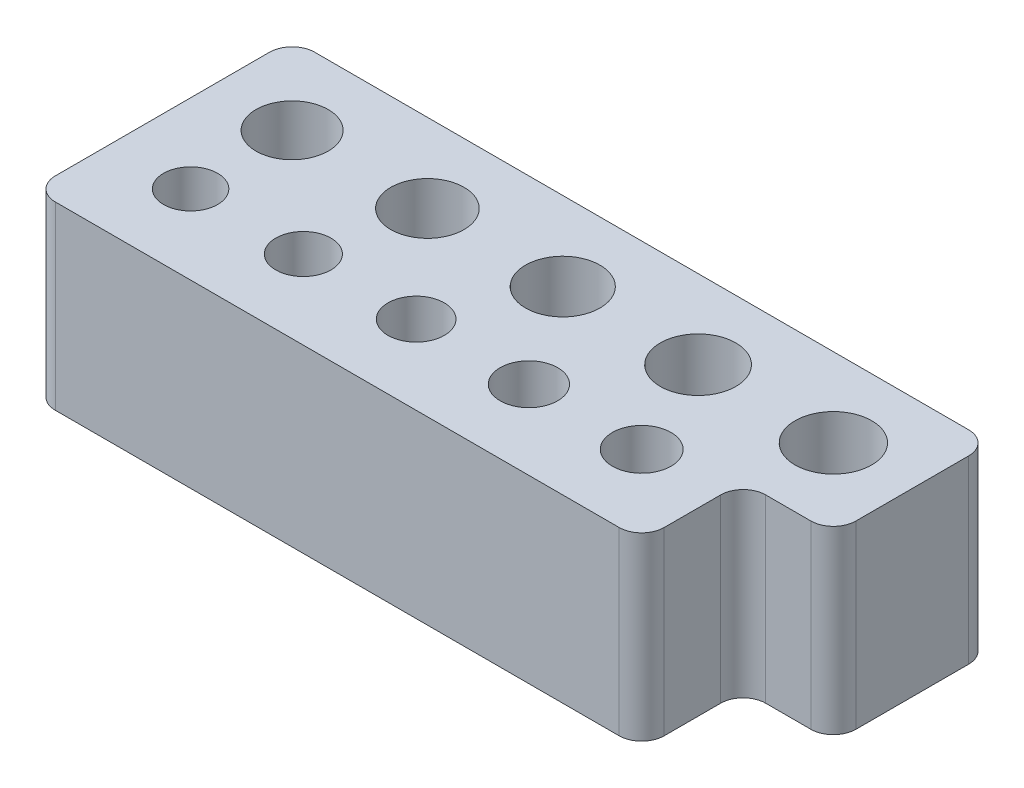
ISO-10303-21;
HEADER;
FILE_DESCRIPTION(('STEP AP214'),'2;1');
FILE_NAME('part.step','',(''),(''),'','','');
FILE_SCHEMA(('AUTOMOTIVE_DESIGN { 1 0 10303 214 1 1 1 1 }'));
ENDSEC;
DATA;
#1=APPLICATION_CONTEXT('core data for automotive mechanical design processes');
#2=APPLICATION_PROTOCOL_DEFINITION('international standard','automotive_design',2000,#1);
#3=PRODUCT_CONTEXT('',#1,'mechanical');
#4=PRODUCT('Part','Part','',(#3));
#5=PRODUCT_RELATED_PRODUCT_CATEGORY('part','',(#4));
#6=PRODUCT_DEFINITION_FORMATION('','',#4);
#7=PRODUCT_DEFINITION_CONTEXT('part definition',#1,'design');
#8=PRODUCT_DEFINITION('design','',#6,#7);
#9=PRODUCT_DEFINITION_SHAPE('','',#8);
#10=(LENGTH_UNIT() NAMED_UNIT(*) SI_UNIT(.MILLI.,.METRE.));
#11=(NAMED_UNIT(*) PLANE_ANGLE_UNIT() SI_UNIT($,.RADIAN.));
#12=(NAMED_UNIT(*) SI_UNIT($,.STERADIAN.) SOLID_ANGLE_UNIT());
#13=UNCERTAINTY_MEASURE_WITH_UNIT(LENGTH_MEASURE(1.E-05),#10,'distance_accuracy_value','');
#14=(GEOMETRIC_REPRESENTATION_CONTEXT(3) GLOBAL_UNCERTAINTY_ASSIGNED_CONTEXT((#13)) GLOBAL_UNIT_ASSIGNED_CONTEXT((#10,
#11,#12)) REPRESENTATION_CONTEXT('',''));
#15=CARTESIAN_POINT('',(0.,0.,0.));
#16=DIRECTION('',(0.,0.,1.));
#17=DIRECTION('',(1.,0.,0.));
#18=AXIS2_PLACEMENT_3D('',#15,#16,#17);
#19=CARTESIAN_POINT('',(0.,8.,0.));
#20=DIRECTION('',(0.,-1.,0.));
#21=DIRECTION('',(0.,0.,-1.));
#22=AXIS2_PLACEMENT_3D('',#19,#20,#21);
#23=PLANE('',#22);
#24=DIRECTION('',(-1.,0.,0.));
#25=VECTOR('',#24,1.);
#26=CARTESIAN_POINT('',(0.,8.,-11.5));
#27=LINE('',#26,#25);
#28=CARTESIAN_POINT('',(30.,8.,-11.5));
#29=VERTEX_POINT('',#28);
#30=CARTESIAN_POINT('',(1.,8.,-11.5));
#31=VERTEX_POINT('',#30);
#32=EDGE_CURVE('E177',#29,#31,#27,.T.);
#33=ORIENTED_EDGE('',*,*,#32,.T.);
#34=CARTESIAN_POINT('',(1.,8.,-10.5));
#35=DIRECTION('',(0.,-1.,0.));
#36=DIRECTION('',(0.,0.,-1.));
#37=AXIS2_PLACEMENT_3D('',#34,#35,#36);
#38=CIRCLE('',#37,1.);
#39=CARTESIAN_POINT('',(0.,8.,-10.5));
#40=VERTEX_POINT('',#39);
#41=EDGE_CURVE('E221',#31,#40,#38,.F.);
#42=ORIENTED_EDGE('',*,*,#41,.T.);
#43=DIRECTION('',(0.,0.,1.));
#44=VECTOR('',#43,1.);
#45=CARTESIAN_POINT('',(0.,8.,0.));
#46=LINE('',#45,#44);
#47=CARTESIAN_POINT('',(0.,8.,-1.));
#48=VERTEX_POINT('',#47);
#49=EDGE_CURVE('E156',#40,#48,#46,.T.);
#50=ORIENTED_EDGE('',*,*,#49,.T.);
#51=CARTESIAN_POINT('',(1.,8.,-1.));
#52=DIRECTION('',(0.,-1.,0.));
#53=DIRECTION('',(0.,0.,-1.));
#54=AXIS2_PLACEMENT_3D('',#51,#52,#53);
#55=CIRCLE('',#54,1.);
#56=CARTESIAN_POINT('',(1.,8.,0.));
#57=VERTEX_POINT('',#56);
#58=EDGE_CURVE('E210',#48,#57,#55,.F.);
#59=ORIENTED_EDGE('',*,*,#58,.T.);
#60=DIRECTION('',(1.,0.,0.));
#61=VECTOR('',#60,1.);
#62=CARTESIAN_POINT('',(0.,8.,0.));
#63=LINE('',#62,#61);
#64=CARTESIAN_POINT('',(26.,8.,0.));
#65=VERTEX_POINT('',#64);
#66=EDGE_CURVE('E276',#57,#65,#63,.T.);
#67=ORIENTED_EDGE('',*,*,#66,.T.);
#68=CARTESIAN_POINT('',(26.,8.,-1.));
#69=DIRECTION('',(0.,-1.,0.));
#70=DIRECTION('',(0.,0.,-1.));
#71=AXIS2_PLACEMENT_3D('',#68,#69,#70);
#72=CIRCLE('',#71,1.);
#73=CARTESIAN_POINT('',(27.,8.,-1.));
#74=VERTEX_POINT('',#73);
#75=EDGE_CURVE('E213',#65,#74,#72,.F.);
#76=ORIENTED_EDGE('',*,*,#75,.T.);
#77=DIRECTION('',(0.,0.,-1.));
#78=VECTOR('',#77,1.);
#79=CARTESIAN_POINT('',(27.,8.,0.));
#80=LINE('',#79,#78);
#81=CARTESIAN_POINT('',(27.,8.,-3.5));
#82=VERTEX_POINT('',#81);
#83=EDGE_CURVE('E267',#74,#82,#80,.T.);
#84=ORIENTED_EDGE('',*,*,#83,.T.);
#85=CARTESIAN_POINT('',(28.,8.,-3.5));
#86=DIRECTION('',(0.,-1.,0.));
#87=DIRECTION('',(0.,0.,-1.));
#88=AXIS2_PLACEMENT_3D('',#85,#86,#87);
#89=CIRCLE('',#88,1.);
#90=CARTESIAN_POINT('',(28.,8.,-4.5));
#91=VERTEX_POINT('',#90);
#92=EDGE_CURVE('E11',#82,#91,#89,.T.);
#93=ORIENTED_EDGE('',*,*,#92,.T.);
#94=DIRECTION('',(1.,0.,0.));
#95=VECTOR('',#94,1.);
#96=CARTESIAN_POINT('',(27.,8.,-4.5));
#97=LINE('',#96,#95);
#98=CARTESIAN_POINT('',(30.,8.,-4.5));
#99=VERTEX_POINT('',#98);
#100=EDGE_CURVE('E266',#91,#99,#97,.T.);
#101=ORIENTED_EDGE('',*,*,#100,.T.);
#102=CARTESIAN_POINT('',(30.,8.,-5.5));
#103=DIRECTION('',(0.,-1.,0.));
#104=DIRECTION('',(0.,0.,-1.));
#105=AXIS2_PLACEMENT_3D('',#102,#103,#104);
#106=CIRCLE('',#105,1.);
#107=CARTESIAN_POINT('',(31.,8.,-5.5));
#108=VERTEX_POINT('',#107);
#109=EDGE_CURVE('E67',#99,#108,#106,.F.);
#110=ORIENTED_EDGE('',*,*,#109,.T.);
#111=DIRECTION('',(0.,0.,-1.));
#112=VECTOR('',#111,1.);
#113=CARTESIAN_POINT('',(31.,8.,-4.5));
#114=LINE('',#113,#112);
#115=CARTESIAN_POINT('',(31.,8.,-10.5));
#116=VERTEX_POINT('',#115);
#117=EDGE_CURVE('E272',#108,#116,#114,.T.);
#118=ORIENTED_EDGE('',*,*,#117,.T.);
#119=CARTESIAN_POINT('',(30.,8.,-10.5));
#120=DIRECTION('',(0.,-1.,0.));
#121=DIRECTION('',(0.,0.,-1.));
#122=AXIS2_PLACEMENT_3D('',#119,#120,#121);
#123=CIRCLE('',#122,1.);
#124=EDGE_CURVE('E218',#116,#29,#123,.F.);
#125=ORIENTED_EDGE('',*,*,#124,.T.);
#126=EDGE_LOOP('',(#33,#42,#50,#59,#67,#76,#84,#93,#101,#110,#118,#125));
#127=FACE_BOUND('',#126,.T.);
#128=CARTESIAN_POINT('',(3.5,8.,-3.5));
#129=DIRECTION('',(0.,1.,0.));
#130=DIRECTION('',(0.,0.,1.));
#131=AXIS2_PLACEMENT_3D('',#128,#129,#130);
#132=CIRCLE('',#131,1.2);
#133=CARTESIAN_POINT('',(3.5,8.,-2.3));
#134=VERTEX_POINT('',#133);
#135=EDGE_CURVE('E166',#134,#134,#132,.T.);
#136=ORIENTED_EDGE('',*,*,#135,.F.);
#137=EDGE_LOOP('',(#136));
#138=FACE_BOUND('',#137,.T.);
#139=CARTESIAN_POINT('',(8.5,8.,-3.5));
#140=DIRECTION('',(0.,1.,0.));
#141=DIRECTION('',(0.,0.,1.));
#142=AXIS2_PLACEMENT_3D('',#139,#140,#141);
#143=CIRCLE('',#142,1.225);
#144=CARTESIAN_POINT('',(8.5,8.,-2.275));
#145=VERTEX_POINT('',#144);
#146=EDGE_CURVE('E286',#145,#145,#143,.T.);
#147=ORIENTED_EDGE('',*,*,#146,.F.);
#148=EDGE_LOOP('',(#147));
#149=FACE_BOUND('',#148,.T.);
#150=CARTESIAN_POINT('',(13.5,8.,-3.5));
#151=DIRECTION('',(0.,1.,0.));
#152=DIRECTION('',(0.,0.,1.));
#153=AXIS2_PLACEMENT_3D('',#150,#151,#152);
#154=CIRCLE('',#153,1.25);
#155=CARTESIAN_POINT('',(13.5,8.,-2.25));
#156=VERTEX_POINT('',#155);
#157=EDGE_CURVE('E292',#156,#156,#154,.T.);
#158=ORIENTED_EDGE('',*,*,#157,.F.);
#159=EDGE_LOOP('',(#158));
#160=FACE_BOUND('',#159,.T.);
#161=CARTESIAN_POINT('',(18.5,8.,-3.5));
#162=DIRECTION('',(0.,1.,0.));
#163=DIRECTION('',(0.,0.,1.));
#164=AXIS2_PLACEMENT_3D('',#161,#162,#163);
#165=CIRCLE('',#164,1.275);
#166=CARTESIAN_POINT('',(18.5,8.,-2.225));
#167=VERTEX_POINT('',#166);
#168=EDGE_CURVE('E300',#167,#167,#165,.T.);
#169=ORIENTED_EDGE('',*,*,#168,.F.);
#170=EDGE_LOOP('',(#169));
#171=FACE_BOUND('',#170,.T.);
#172=CARTESIAN_POINT('',(23.5,8.,-3.5));
#173=DIRECTION('',(0.,1.,0.));
#174=DIRECTION('',(0.,0.,1.));
#175=AXIS2_PLACEMENT_3D('',#172,#173,#174);
#176=CIRCLE('',#175,1.3);
#177=CARTESIAN_POINT('',(23.5,8.,-2.2));
#178=VERTEX_POINT('',#177);
#179=EDGE_CURVE('E308',#178,#178,#176,.T.);
#180=ORIENTED_EDGE('',*,*,#179,.F.);
#181=EDGE_LOOP('',(#180));
#182=FACE_BOUND('',#181,.T.);
#183=CARTESIAN_POINT('',(3.5,8.,-8.));
#184=DIRECTION('',(0.,1.,0.));
#185=DIRECTION('',(0.,0.,1.));
#186=AXIS2_PLACEMENT_3D('',#183,#184,#185);
#187=CIRCLE('',#186,1.6);
#188=CARTESIAN_POINT('',(3.5,8.,-6.4));
#189=VERTEX_POINT('',#188);
#190=EDGE_CURVE('E316',#189,#189,#187,.T.);
#191=ORIENTED_EDGE('',*,*,#190,.F.);
#192=EDGE_LOOP('',(#191));
#193=FACE_BOUND('',#192,.T.);
#194=CARTESIAN_POINT('',(9.5,8.,-8.));
#195=DIRECTION('',(0.,1.,0.));
#196=DIRECTION('',(0.,0.,1.));
#197=AXIS2_PLACEMENT_3D('',#194,#195,#196);
#198=CIRCLE('',#197,1.625);
#199=CARTESIAN_POINT('',(9.5,8.,-6.375));
#200=VERTEX_POINT('',#199);
#201=EDGE_CURVE('E324',#200,#200,#198,.T.);
#202=ORIENTED_EDGE('',*,*,#201,.F.);
#203=EDGE_LOOP('',(#202));
#204=FACE_BOUND('',#203,.T.);
#205=CARTESIAN_POINT('',(15.5,8.,-8.));
#206=DIRECTION('',(0.,1.,0.));
#207=DIRECTION('',(0.,0.,1.));
#208=AXIS2_PLACEMENT_3D('',#205,#206,#207);
#209=CIRCLE('',#208,1.65);
#210=CARTESIAN_POINT('',(15.5,8.,-6.35));
#211=VERTEX_POINT('',#210);
#212=EDGE_CURVE('E332',#211,#211,#209,.T.);
#213=ORIENTED_EDGE('',*,*,#212,.F.);
#214=EDGE_LOOP('',(#213));
#215=FACE_BOUND('',#214,.T.);
#216=CARTESIAN_POINT('',(21.5,8.,-8.));
#217=DIRECTION('',(0.,1.,0.));
#218=DIRECTION('',(0.,0.,1.));
#219=AXIS2_PLACEMENT_3D('',#216,#217,#218);
#220=CIRCLE('',#219,1.675);
#221=CARTESIAN_POINT('',(21.5,8.,-6.325));
#222=VERTEX_POINT('',#221);
#223=EDGE_CURVE('E340',#222,#222,#220,.T.);
#224=ORIENTED_EDGE('',*,*,#223,.F.);
#225=EDGE_LOOP('',(#224));
#226=FACE_BOUND('',#225,.T.);
#227=CARTESIAN_POINT('',(27.5,8.,-8.));
#228=DIRECTION('',(0.,1.,0.));
#229=DIRECTION('',(0.,0.,1.));
#230=AXIS2_PLACEMENT_3D('',#227,#228,#229);
#231=CIRCLE('',#230,1.7);
#232=CARTESIAN_POINT('',(27.5,8.,-6.3));
#233=VERTEX_POINT('',#232);
#234=EDGE_CURVE('E348',#233,#233,#231,.T.);
#235=ORIENTED_EDGE('',*,*,#234,.F.);
#236=EDGE_LOOP('',(#235));
#237=FACE_BOUND('',#236,.T.);
#238=ADVANCED_FACE('F44',(#127,#138,#149,#160,#171,#182,#193,#204,#215,#226,#237),#23,.F.);
#239=CARTESIAN_POINT('',(0.,0.,0.));
#240=DIRECTION('',(0.,-1.,0.));
#241=DIRECTION('',(0.,0.,-1.));
#242=AXIS2_PLACEMENT_3D('',#239,#240,#241);
#243=PLANE('',#242);
#244=CARTESIAN_POINT('',(21.5,0.,-8.));
#245=DIRECTION('',(0.,1.,0.));
#246=DIRECTION('',(0.,0.,1.));
#247=AXIS2_PLACEMENT_3D('',#244,#245,#246);
#248=CIRCLE('',#247,1.675);
#249=CARTESIAN_POINT('',(21.5,0.,-6.325));
#250=VERTEX_POINT('',#249);
#251=EDGE_CURVE('E344',#250,#250,#248,.T.);
#252=ORIENTED_EDGE('',*,*,#251,.T.);
#253=EDGE_LOOP('',(#252));
#254=FACE_BOUND('',#253,.T.);
#255=CARTESIAN_POINT('',(9.5,0.,-8.));
#256=DIRECTION('',(0.,1.,0.));
#257=DIRECTION('',(0.,0.,1.));
#258=AXIS2_PLACEMENT_3D('',#255,#256,#257);
#259=CIRCLE('',#258,1.625);
#260=CARTESIAN_POINT('',(9.5,0.,-6.375));
#261=VERTEX_POINT('',#260);
#262=EDGE_CURVE('E328',#261,#261,#259,.T.);
#263=ORIENTED_EDGE('',*,*,#262,.T.);
#264=EDGE_LOOP('',(#263));
#265=FACE_BOUND('',#264,.T.);
#266=CARTESIAN_POINT('',(23.5,0.,-3.5));
#267=DIRECTION('',(0.,1.,0.));
#268=DIRECTION('',(0.,0.,1.));
#269=AXIS2_PLACEMENT_3D('',#266,#267,#268);
#270=CIRCLE('',#269,1.3);
#271=CARTESIAN_POINT('',(23.5,0.,-2.2));
#272=VERTEX_POINT('',#271);
#273=EDGE_CURVE('E312',#272,#272,#270,.T.);
#274=ORIENTED_EDGE('',*,*,#273,.T.);
#275=EDGE_LOOP('',(#274));
#276=FACE_BOUND('',#275,.T.);
#277=CARTESIAN_POINT('',(13.5,0.,-3.5));
#278=DIRECTION('',(0.,1.,0.));
#279=DIRECTION('',(0.,0.,1.));
#280=AXIS2_PLACEMENT_3D('',#277,#278,#279);
#281=CIRCLE('',#280,1.25);
#282=CARTESIAN_POINT('',(13.5,0.,-2.25));
#283=VERTEX_POINT('',#282);
#284=EDGE_CURVE('E296',#283,#283,#281,.T.);
#285=ORIENTED_EDGE('',*,*,#284,.T.);
#286=EDGE_LOOP('',(#285));
#287=FACE_BOUND('',#286,.T.);
#288=CARTESIAN_POINT('',(3.5,0.,-3.5));
#289=DIRECTION('',(0.,1.,0.));
#290=DIRECTION('',(0.,0.,1.));
#291=AXIS2_PLACEMENT_3D('',#288,#289,#290);
#292=CIRCLE('',#291,1.2);
#293=CARTESIAN_POINT('',(3.5,0.,-2.3));
#294=VERTEX_POINT('',#293);
#295=EDGE_CURVE('E174',#294,#294,#292,.T.);
#296=ORIENTED_EDGE('',*,*,#295,.T.);
#297=EDGE_LOOP('',(#296));
#298=FACE_BOUND('',#297,.T.);
#299=DIRECTION('',(0.,0.,1.));
#300=VECTOR('',#299,1.);
#301=CARTESIAN_POINT('',(0.,0.,0.));
#302=LINE('',#301,#300);
#303=CARTESIAN_POINT('',(0.,0.,-10.5));
#304=VERTEX_POINT('',#303);
#305=CARTESIAN_POINT('',(0.,0.,-1.));
#306=VERTEX_POINT('',#305);
#307=EDGE_CURVE('E153',#304,#306,#302,.T.);
#308=ORIENTED_EDGE('',*,*,#307,.F.);
#309=CARTESIAN_POINT('',(1.,0.,-10.5));
#310=DIRECTION('',(0.,-1.,0.));
#311=DIRECTION('',(0.,0.,-1.));
#312=AXIS2_PLACEMENT_3D('',#309,#310,#311);
#313=CIRCLE('',#312,1.);
#314=CARTESIAN_POINT('',(1.,0.,-11.5));
#315=VERTEX_POINT('',#314);
#316=EDGE_CURVE('E135',#304,#315,#313,.T.);
#317=ORIENTED_EDGE('',*,*,#316,.T.);
#318=DIRECTION('',(-1.,0.,0.));
#319=VECTOR('',#318,1.);
#320=CARTESIAN_POINT('',(0.,0.,-11.5));
#321=LINE('',#320,#319);
#322=CARTESIAN_POINT('',(30.,0.,-11.5));
#323=VERTEX_POINT('',#322);
#324=EDGE_CURVE('E190',#323,#315,#321,.T.);
#325=ORIENTED_EDGE('',*,*,#324,.F.);
#326=CARTESIAN_POINT('',(30.,0.,-10.5));
#327=DIRECTION('',(0.,-1.,0.));
#328=DIRECTION('',(0.,0.,-1.));
#329=AXIS2_PLACEMENT_3D('',#326,#327,#328);
#330=CIRCLE('',#329,1.);
#331=CARTESIAN_POINT('',(31.,0.,-10.5));
#332=VERTEX_POINT('',#331);
#333=EDGE_CURVE('E147',#323,#332,#330,.T.);
#334=ORIENTED_EDGE('',*,*,#333,.T.);
#335=DIRECTION('',(0.,0.,-1.));
#336=VECTOR('',#335,1.);
#337=CARTESIAN_POINT('',(31.,0.,-4.5));
#338=LINE('',#337,#336);
#339=CARTESIAN_POINT('',(31.,0.,-5.5));
#340=VERTEX_POINT('',#339);
#341=EDGE_CURVE('E187',#340,#332,#338,.T.);
#342=ORIENTED_EDGE('',*,*,#341,.F.);
#343=CARTESIAN_POINT('',(30.,0.,-5.5));
#344=DIRECTION('',(0.,-1.,0.));
#345=DIRECTION('',(0.,0.,-1.));
#346=AXIS2_PLACEMENT_3D('',#343,#344,#345);
#347=CIRCLE('',#346,1.);
#348=CARTESIAN_POINT('',(30.,0.,-4.5));
#349=VERTEX_POINT('',#348);
#350=EDGE_CURVE('E200',#340,#349,#347,.T.);
#351=ORIENTED_EDGE('',*,*,#350,.T.);
#352=DIRECTION('',(1.,0.,0.));
#353=VECTOR('',#352,1.);
#354=CARTESIAN_POINT('',(27.,0.,-4.5));
#355=LINE('',#354,#353);
#356=CARTESIAN_POINT('',(28.,0.,-4.5));
#357=VERTEX_POINT('',#356);
#358=EDGE_CURVE('E183',#357,#349,#355,.T.);
#359=ORIENTED_EDGE('',*,*,#358,.F.);
#360=CARTESIAN_POINT('',(28.,0.,-3.5));
#361=DIRECTION('',(0.,-1.,0.));
#362=DIRECTION('',(0.,0.,-1.));
#363=AXIS2_PLACEMENT_3D('',#360,#361,#362);
#364=CIRCLE('',#363,1.);
#365=CARTESIAN_POINT('',(27.,0.,-3.5));
#366=VERTEX_POINT('',#365);
#367=EDGE_CURVE('E53',#357,#366,#364,.F.);
#368=ORIENTED_EDGE('',*,*,#367,.T.);
#369=DIRECTION('',(0.,0.,-1.));
#370=VECTOR('',#369,1.);
#371=CARTESIAN_POINT('',(27.,0.,0.));
#372=LINE('',#371,#370);
#373=CARTESIAN_POINT('',(27.,0.,-1.));
#374=VERTEX_POINT('',#373);
#375=EDGE_CURVE('E171',#374,#366,#372,.T.);
#376=ORIENTED_EDGE('',*,*,#375,.F.);
#377=CARTESIAN_POINT('',(26.,0.,-1.));
#378=DIRECTION('',(0.,-1.,0.));
#379=DIRECTION('',(0.,0.,-1.));
#380=AXIS2_PLACEMENT_3D('',#377,#378,#379);
#381=CIRCLE('',#380,1.);
#382=CARTESIAN_POINT('',(26.,0.,0.));
#383=VERTEX_POINT('',#382);
#384=EDGE_CURVE('E197',#374,#383,#381,.T.);
#385=ORIENTED_EDGE('',*,*,#384,.T.);
#386=DIRECTION('',(1.,0.,0.));
#387=VECTOR('',#386,1.);
#388=CARTESIAN_POINT('',(0.,0.,0.));
#389=LINE('',#388,#387);
#390=CARTESIAN_POINT('',(1.,0.,0.));
#391=VERTEX_POINT('',#390);
#392=EDGE_CURVE('E165',#391,#383,#389,.T.);
#393=ORIENTED_EDGE('',*,*,#392,.F.);
#394=CARTESIAN_POINT('',(1.,0.,-1.));
#395=DIRECTION('',(0.,-1.,0.));
#396=DIRECTION('',(0.,0.,-1.));
#397=AXIS2_PLACEMENT_3D('',#394,#395,#396);
#398=CIRCLE('',#397,1.);
#399=EDGE_CURVE('E158',#391,#306,#398,.T.);
#400=ORIENTED_EDGE('',*,*,#399,.T.);
#401=EDGE_LOOP('',(#308,#317,#325,#334,#342,#351,#359,#368,#376,#385,#393,#400));
#402=FACE_BOUND('',#401,.T.);
#403=CARTESIAN_POINT('',(8.5,0.,-3.5));
#404=DIRECTION('',(0.,1.,0.));
#405=DIRECTION('',(0.,0.,1.));
#406=AXIS2_PLACEMENT_3D('',#403,#404,#405);
#407=CIRCLE('',#406,1.225);
#408=CARTESIAN_POINT('',(8.5,0.,-2.275));
#409=VERTEX_POINT('',#408);
#410=EDGE_CURVE('E288',#409,#409,#407,.T.);
#411=ORIENTED_EDGE('',*,*,#410,.T.);
#412=EDGE_LOOP('',(#411));
#413=FACE_BOUND('',#412,.T.);
#414=CARTESIAN_POINT('',(18.5,0.,-3.5));
#415=DIRECTION('',(0.,1.,0.));
#416=DIRECTION('',(0.,0.,1.));
#417=AXIS2_PLACEMENT_3D('',#414,#415,#416);
#418=CIRCLE('',#417,1.275);
#419=CARTESIAN_POINT('',(18.5,0.,-2.225));
#420=VERTEX_POINT('',#419);
#421=EDGE_CURVE('E304',#420,#420,#418,.T.);
#422=ORIENTED_EDGE('',*,*,#421,.T.);
#423=EDGE_LOOP('',(#422));
#424=FACE_BOUND('',#423,.T.);
#425=CARTESIAN_POINT('',(3.5,0.,-8.));
#426=DIRECTION('',(0.,1.,0.));
#427=DIRECTION('',(0.,0.,1.));
#428=AXIS2_PLACEMENT_3D('',#425,#426,#427);
#429=CIRCLE('',#428,1.6);
#430=CARTESIAN_POINT('',(3.5,0.,-6.4));
#431=VERTEX_POINT('',#430);
#432=EDGE_CURVE('E320',#431,#431,#429,.T.);
#433=ORIENTED_EDGE('',*,*,#432,.T.);
#434=EDGE_LOOP('',(#433));
#435=FACE_BOUND('',#434,.T.);
#436=CARTESIAN_POINT('',(15.5,0.,-8.));
#437=DIRECTION('',(0.,1.,0.));
#438=DIRECTION('',(0.,0.,1.));
#439=AXIS2_PLACEMENT_3D('',#436,#437,#438);
#440=CIRCLE('',#439,1.65);
#441=CARTESIAN_POINT('',(15.5,0.,-6.35));
#442=VERTEX_POINT('',#441);
#443=EDGE_CURVE('E336',#442,#442,#440,.T.);
#444=ORIENTED_EDGE('',*,*,#443,.T.);
#445=EDGE_LOOP('',(#444));
#446=FACE_BOUND('',#445,.T.);
#447=CARTESIAN_POINT('',(27.5,0.,-8.));
#448=DIRECTION('',(0.,1.,0.));
#449=DIRECTION('',(0.,0.,1.));
#450=AXIS2_PLACEMENT_3D('',#447,#448,#449);
#451=CIRCLE('',#450,1.7);
#452=CARTESIAN_POINT('',(27.5,0.,-6.3));
#453=VERTEX_POINT('',#452);
#454=EDGE_CURVE('E352',#453,#453,#451,.T.);
#455=ORIENTED_EDGE('',*,*,#454,.T.);
#456=EDGE_LOOP('',(#455));
#457=FACE_BOUND('',#456,.T.);
#458=ADVANCED_FACE('F161',(#254,#265,#276,#287,#298,#402,#413,#424,#435,#446,#457),#243,.T.);
#459=CARTESIAN_POINT('',(0.,8.,0.));
#460=DIRECTION('',(1.,0.,0.));
#461=DIRECTION('',(0.,0.,-1.));
#462=AXIS2_PLACEMENT_3D('',#459,#460,#461);
#463=PLANE('',#462);
#464=ORIENTED_EDGE('',*,*,#49,.F.);
#465=DIRECTION('',(0.,-1.,0.));
#466=VECTOR('',#465,1.);
#467=CARTESIAN_POINT('',(0.,8.,-10.5));
#468=LINE('',#467,#466);
#469=EDGE_CURVE('E139',#40,#304,#468,.T.);
#470=ORIENTED_EDGE('',*,*,#469,.T.);
#471=ORIENTED_EDGE('',*,*,#307,.T.);
#472=DIRECTION('',(0.,-1.,0.));
#473=VECTOR('',#472,1.);
#474=CARTESIAN_POINT('',(0.,8.,-1.));
#475=LINE('',#474,#473);
#476=EDGE_CURVE('E159',#306,#48,#475,.F.);
#477=ORIENTED_EDGE('',*,*,#476,.T.);
#478=EDGE_LOOP('',(#464,#470,#471,#477));
#479=FACE_BOUND('',#478,.T.);
#480=ADVANCED_FACE('F152',(#479),#463,.F.);
#481=CARTESIAN_POINT('',(0.,8.,0.));
#482=DIRECTION('',(0.,0.,-1.));
#483=DIRECTION('',(-1.,0.,0.));
#484=AXIS2_PLACEMENT_3D('',#481,#482,#483);
#485=PLANE('',#484);
#486=ORIENTED_EDGE('',*,*,#392,.T.);
#487=DIRECTION('',(0.,-1.,0.));
#488=VECTOR('',#487,1.);
#489=CARTESIAN_POINT('',(26.,8.,0.));
#490=LINE('',#489,#488);
#491=EDGE_CURVE('E248',#383,#65,#490,.F.);
#492=ORIENTED_EDGE('',*,*,#491,.T.);
#493=ORIENTED_EDGE('',*,*,#66,.F.);
#494=DIRECTION('',(0.,-1.,0.));
#495=VECTOR('',#494,1.);
#496=CARTESIAN_POINT('',(1.,8.,0.));
#497=LINE('',#496,#495);
#498=EDGE_CURVE('E244',#57,#391,#497,.T.);
#499=ORIENTED_EDGE('',*,*,#498,.T.);
#500=EDGE_LOOP('',(#486,#492,#493,#499));
#501=FACE_BOUND('',#500,.T.);
#502=ADVANCED_FACE('F386',(#501),#485,.F.);
#503=CARTESIAN_POINT('',(27.,8.,0.));
#504=DIRECTION('',(-1.,0.,0.));
#505=DIRECTION('',(0.,0.,1.));
#506=AXIS2_PLACEMENT_3D('',#503,#504,#505);
#507=PLANE('',#506);
#508=ORIENTED_EDGE('',*,*,#375,.T.);
#509=DIRECTION('',(0.,-1.,0.));
#510=VECTOR('',#509,1.);
#511=CARTESIAN_POINT('',(27.,8.,-3.5));
#512=LINE('',#511,#510);
#513=EDGE_CURVE('E241',#366,#82,#512,.F.);
#514=ORIENTED_EDGE('',*,*,#513,.T.);
#515=ORIENTED_EDGE('',*,*,#83,.F.);
#516=DIRECTION('',(0.,-1.,0.));
#517=VECTOR('',#516,1.);
#518=CARTESIAN_POINT('',(27.,8.,-1.));
#519=LINE('',#518,#517);
#520=EDGE_CURVE('E237',#74,#374,#519,.T.);
#521=ORIENTED_EDGE('',*,*,#520,.T.);
#522=EDGE_LOOP('',(#508,#514,#515,#521));
#523=FACE_BOUND('',#522,.T.);
#524=ADVANCED_FACE('F257',(#523),#507,.F.);
#525=CARTESIAN_POINT('',(27.,8.,-4.5));
#526=DIRECTION('',(0.,0.,-1.));
#527=DIRECTION('',(-1.,0.,0.));
#528=AXIS2_PLACEMENT_3D('',#525,#526,#527);
#529=PLANE('',#528);
#530=ORIENTED_EDGE('',*,*,#358,.T.);
#531=DIRECTION('',(0.,-1.,0.));
#532=VECTOR('',#531,1.);
#533=CARTESIAN_POINT('',(30.,8.,-4.5));
#534=LINE('',#533,#532);
#535=EDGE_CURVE('E234',#349,#99,#534,.F.);
#536=ORIENTED_EDGE('',*,*,#535,.T.);
#537=ORIENTED_EDGE('',*,*,#100,.F.);
#538=DIRECTION('',(0.,-1.,0.));
#539=VECTOR('',#538,1.);
#540=CARTESIAN_POINT('',(28.,0.,-4.5));
#541=LINE('',#540,#539);
#542=EDGE_CURVE('E230',#91,#357,#541,.T.);
#543=ORIENTED_EDGE('',*,*,#542,.T.);
#544=EDGE_LOOP('',(#530,#536,#537,#543));
#545=FACE_BOUND('',#544,.T.);
#546=ADVANCED_FACE('F269',(#545),#529,.F.);
#547=CARTESIAN_POINT('',(31.,8.,-4.5));
#548=DIRECTION('',(-1.,0.,0.));
#549=DIRECTION('',(0.,0.,1.));
#550=AXIS2_PLACEMENT_3D('',#547,#548,#549);
#551=PLANE('',#550);
#552=ORIENTED_EDGE('',*,*,#341,.T.);
#553=DIRECTION('',(0.,-1.,0.));
#554=VECTOR('',#553,1.);
#555=CARTESIAN_POINT('',(31.,8.,-10.5));
#556=LINE('',#555,#554);
#557=EDGE_CURVE('E60',#332,#116,#556,.F.);
#558=ORIENTED_EDGE('',*,*,#557,.T.);
#559=ORIENTED_EDGE('',*,*,#117,.F.);
#560=DIRECTION('',(0.,-1.,0.));
#561=VECTOR('',#560,1.);
#562=CARTESIAN_POINT('',(31.,8.,-5.5));
#563=LINE('',#562,#561);
#564=EDGE_CURVE('E224',#108,#340,#563,.T.);
#565=ORIENTED_EDGE('',*,*,#564,.T.);
#566=EDGE_LOOP('',(#552,#558,#559,#565));
#567=FACE_BOUND('',#566,.T.);
#568=ADVANCED_FACE('F378',(#567),#551,.F.);
#569=CARTESIAN_POINT('',(0.,8.,-11.5));
#570=DIRECTION('',(0.,0.,1.));
#571=DIRECTION('',(1.,0.,0.));
#572=AXIS2_PLACEMENT_3D('',#569,#570,#571);
#573=PLANE('',#572);
#574=ORIENTED_EDGE('',*,*,#324,.T.);
#575=DIRECTION('',(0.,-1.,0.));
#576=VECTOR('',#575,1.);
#577=CARTESIAN_POINT('',(1.,8.,-11.5));
#578=LINE('',#577,#576);
#579=EDGE_CURVE('E140',#315,#31,#578,.F.);
#580=ORIENTED_EDGE('',*,*,#579,.T.);
#581=ORIENTED_EDGE('',*,*,#32,.F.);
#582=DIRECTION('',(0.,-1.,0.));
#583=VECTOR('',#582,1.);
#584=CARTESIAN_POINT('',(30.,8.,-11.5));
#585=LINE('',#584,#583);
#586=EDGE_CURVE('E146',#29,#323,#585,.T.);
#587=ORIENTED_EDGE('',*,*,#586,.T.);
#588=EDGE_LOOP('',(#574,#580,#581,#587));
#589=FACE_BOUND('',#588,.T.);
#590=ADVANCED_FACE('F375',(#589),#573,.F.);
#591=CARTESIAN_POINT('',(3.5,8.,-3.5));
#592=DIRECTION('',(0.,-1.,0.));
#593=DIRECTION('',(0.,0.,-1.));
#594=AXIS2_PLACEMENT_3D('',#591,#592,#593);
#595=CYLINDRICAL_SURFACE('',#594,1.2);
#596=ORIENTED_EDGE('',*,*,#135,.T.);
#597=EDGE_LOOP('',(#596));
#598=FACE_BOUND('',#597,.T.);
#599=ORIENTED_EDGE('',*,*,#295,.F.);
#600=EDGE_LOOP('',(#599));
#601=FACE_BOUND('',#600,.T.);
#602=ADVANCED_FACE('F372',(#598,#601),#595,.F.);
#603=CARTESIAN_POINT('',(8.5,8.,-3.5));
#604=DIRECTION('',(0.,-1.,0.));
#605=DIRECTION('',(0.,0.,-1.));
#606=AXIS2_PLACEMENT_3D('',#603,#604,#605);
#607=CYLINDRICAL_SURFACE('',#606,1.225);
#608=ORIENTED_EDGE('',*,*,#146,.T.);
#609=EDGE_LOOP('',(#608));
#610=FACE_BOUND('',#609,.T.);
#611=ORIENTED_EDGE('',*,*,#410,.F.);
#612=EDGE_LOOP('',(#611));
#613=FACE_BOUND('',#612,.T.);
#614=ADVANCED_FACE('F529',(#610,#613),#607,.F.);
#615=CARTESIAN_POINT('',(13.5,8.,-3.5));
#616=DIRECTION('',(0.,-1.,0.));
#617=DIRECTION('',(0.,0.,-1.));
#618=AXIS2_PLACEMENT_3D('',#615,#616,#617);
#619=CYLINDRICAL_SURFACE('',#618,1.25);
#620=ORIENTED_EDGE('',*,*,#157,.T.);
#621=EDGE_LOOP('',(#620));
#622=FACE_BOUND('',#621,.T.);
#623=ORIENTED_EDGE('',*,*,#284,.F.);
#624=EDGE_LOOP('',(#623));
#625=FACE_BOUND('',#624,.T.);
#626=ADVANCED_FACE('F519',(#622,#625),#619,.F.);
#627=CARTESIAN_POINT('',(18.5,8.,-3.5));
#628=DIRECTION('',(0.,-1.,0.));
#629=DIRECTION('',(0.,0.,-1.));
#630=AXIS2_PLACEMENT_3D('',#627,#628,#629);
#631=CYLINDRICAL_SURFACE('',#630,1.275);
#632=ORIENTED_EDGE('',*,*,#168,.T.);
#633=EDGE_LOOP('',(#632));
#634=FACE_BOUND('',#633,.T.);
#635=ORIENTED_EDGE('',*,*,#421,.F.);
#636=EDGE_LOOP('',(#635));
#637=FACE_BOUND('',#636,.T.);
#638=ADVANCED_FACE('F509',(#634,#637),#631,.F.);
#639=CARTESIAN_POINT('',(23.5,8.,-3.5));
#640=DIRECTION('',(0.,-1.,0.));
#641=DIRECTION('',(0.,0.,-1.));
#642=AXIS2_PLACEMENT_3D('',#639,#640,#641);
#643=CYLINDRICAL_SURFACE('',#642,1.3);
#644=ORIENTED_EDGE('',*,*,#179,.T.);
#645=EDGE_LOOP('',(#644));
#646=FACE_BOUND('',#645,.T.);
#647=ORIENTED_EDGE('',*,*,#273,.F.);
#648=EDGE_LOOP('',(#647));
#649=FACE_BOUND('',#648,.T.);
#650=ADVANCED_FACE('F499',(#646,#649),#643,.F.);
#651=CARTESIAN_POINT('',(3.5,8.,-8.));
#652=DIRECTION('',(0.,-1.,0.));
#653=DIRECTION('',(0.,0.,-1.));
#654=AXIS2_PLACEMENT_3D('',#651,#652,#653);
#655=CYLINDRICAL_SURFACE('',#654,1.6);
#656=ORIENTED_EDGE('',*,*,#190,.T.);
#657=EDGE_LOOP('',(#656));
#658=FACE_BOUND('',#657,.T.);
#659=ORIENTED_EDGE('',*,*,#432,.F.);
#660=EDGE_LOOP('',(#659));
#661=FACE_BOUND('',#660,.T.);
#662=ADVANCED_FACE('F489',(#658,#661),#655,.F.);
#663=CARTESIAN_POINT('',(9.5,8.,-8.));
#664=DIRECTION('',(0.,-1.,0.));
#665=DIRECTION('',(0.,0.,-1.));
#666=AXIS2_PLACEMENT_3D('',#663,#664,#665);
#667=CYLINDRICAL_SURFACE('',#666,1.625);
#668=ORIENTED_EDGE('',*,*,#201,.T.);
#669=EDGE_LOOP('',(#668));
#670=FACE_BOUND('',#669,.T.);
#671=ORIENTED_EDGE('',*,*,#262,.F.);
#672=EDGE_LOOP('',(#671));
#673=FACE_BOUND('',#672,.T.);
#674=ADVANCED_FACE('F479',(#670,#673),#667,.F.);
#675=CARTESIAN_POINT('',(15.5,8.,-8.));
#676=DIRECTION('',(0.,-1.,0.));
#677=DIRECTION('',(0.,0.,-1.));
#678=AXIS2_PLACEMENT_3D('',#675,#676,#677);
#679=CYLINDRICAL_SURFACE('',#678,1.65);
#680=ORIENTED_EDGE('',*,*,#212,.T.);
#681=EDGE_LOOP('',(#680));
#682=FACE_BOUND('',#681,.T.);
#683=ORIENTED_EDGE('',*,*,#443,.F.);
#684=EDGE_LOOP('',(#683));
#685=FACE_BOUND('',#684,.T.);
#686=ADVANCED_FACE('F469',(#682,#685),#679,.F.);
#687=CARTESIAN_POINT('',(21.5,8.,-8.));
#688=DIRECTION('',(0.,-1.,0.));
#689=DIRECTION('',(0.,0.,-1.));
#690=AXIS2_PLACEMENT_3D('',#687,#688,#689);
#691=CYLINDRICAL_SURFACE('',#690,1.675);
#692=ORIENTED_EDGE('',*,*,#223,.T.);
#693=EDGE_LOOP('',(#692));
#694=FACE_BOUND('',#693,.T.);
#695=ORIENTED_EDGE('',*,*,#251,.F.);
#696=EDGE_LOOP('',(#695));
#697=FACE_BOUND('',#696,.T.);
#698=ADVANCED_FACE('F460',(#694,#697),#691,.F.);
#699=CARTESIAN_POINT('',(27.5,8.,-8.));
#700=DIRECTION('',(0.,-1.,0.));
#701=DIRECTION('',(0.,0.,-1.));
#702=AXIS2_PLACEMENT_3D('',#699,#700,#701);
#703=CYLINDRICAL_SURFACE('',#702,1.7);
#704=ORIENTED_EDGE('',*,*,#234,.T.);
#705=EDGE_LOOP('',(#704));
#706=FACE_BOUND('',#705,.T.);
#707=ORIENTED_EDGE('',*,*,#454,.F.);
#708=EDGE_LOOP('',(#707));
#709=FACE_BOUND('',#708,.T.);
#710=ADVANCED_FACE('F360',(#706,#709),#703,.F.);
#711=CARTESIAN_POINT('',(1.,8.,-10.5));
#712=DIRECTION('',(0.,-1.,0.));
#713=DIRECTION('',(0.,0.,-1.));
#714=AXIS2_PLACEMENT_3D('',#711,#712,#713);
#715=CYLINDRICAL_SURFACE('',#714,1.);
#716=ORIENTED_EDGE('',*,*,#41,.F.);
#717=ORIENTED_EDGE('',*,*,#579,.F.);
#718=ORIENTED_EDGE('',*,*,#316,.F.);
#719=ORIENTED_EDGE('',*,*,#469,.F.);
#720=EDGE_LOOP('',(#716,#717,#718,#719));
#721=FACE_BOUND('',#720,.T.);
#722=ADVANCED_FACE('F138',(#721),#715,.T.);
#723=CARTESIAN_POINT('',(30.,8.,-10.5));
#724=DIRECTION('',(0.,-1.,0.));
#725=DIRECTION('',(0.,0.,-1.));
#726=AXIS2_PLACEMENT_3D('',#723,#724,#725);
#727=CYLINDRICAL_SURFACE('',#726,1.);
#728=ORIENTED_EDGE('',*,*,#124,.F.);
#729=ORIENTED_EDGE('',*,*,#557,.F.);
#730=ORIENTED_EDGE('',*,*,#333,.F.);
#731=ORIENTED_EDGE('',*,*,#586,.F.);
#732=EDGE_LOOP('',(#728,#729,#730,#731));
#733=FACE_BOUND('',#732,.T.);
#734=ADVANCED_FACE('F394',(#733),#727,.T.);
#735=CARTESIAN_POINT('',(30.,8.,-5.5));
#736=DIRECTION('',(0.,-1.,0.));
#737=DIRECTION('',(0.,0.,-1.));
#738=AXIS2_PLACEMENT_3D('',#735,#736,#737);
#739=CYLINDRICAL_SURFACE('',#738,1.);
#740=ORIENTED_EDGE('',*,*,#109,.F.);
#741=ORIENTED_EDGE('',*,*,#535,.F.);
#742=ORIENTED_EDGE('',*,*,#350,.F.);
#743=ORIENTED_EDGE('',*,*,#564,.F.);
#744=EDGE_LOOP('',(#740,#741,#742,#743));
#745=FACE_BOUND('',#744,.T.);
#746=ADVANCED_FACE('F397',(#745),#739,.T.);
#747=CARTESIAN_POINT('',(28.,8.,-3.5));
#748=DIRECTION('',(0.,1.,0.));
#749=DIRECTION('',(0.,0.,1.));
#750=AXIS2_PLACEMENT_3D('',#747,#748,#749);
#751=CYLINDRICAL_SURFACE('',#750,1.);
#752=ORIENTED_EDGE('',*,*,#92,.F.);
#753=ORIENTED_EDGE('',*,*,#513,.F.);
#754=ORIENTED_EDGE('',*,*,#367,.F.);
#755=ORIENTED_EDGE('',*,*,#542,.F.);
#756=EDGE_LOOP('',(#752,#753,#754,#755));
#757=FACE_BOUND('',#756,.T.);
#758=ADVANCED_FACE('F262',(#757),#751,.F.);
#759=CARTESIAN_POINT('',(26.,8.,-1.));
#760=DIRECTION('',(0.,-1.,0.));
#761=DIRECTION('',(0.,0.,-1.));
#762=AXIS2_PLACEMENT_3D('',#759,#760,#761);
#763=CYLINDRICAL_SURFACE('',#762,1.);
#764=ORIENTED_EDGE('',*,*,#75,.F.);
#765=ORIENTED_EDGE('',*,*,#491,.F.);
#766=ORIENTED_EDGE('',*,*,#384,.F.);
#767=ORIENTED_EDGE('',*,*,#520,.F.);
#768=EDGE_LOOP('',(#764,#765,#766,#767));
#769=FACE_BOUND('',#768,.T.);
#770=ADVANCED_FACE('F403',(#769),#763,.T.);
#771=CARTESIAN_POINT('',(1.,8.,-1.));
#772=DIRECTION('',(0.,-1.,0.));
#773=DIRECTION('',(0.,0.,-1.));
#774=AXIS2_PLACEMENT_3D('',#771,#772,#773);
#775=CYLINDRICAL_SURFACE('',#774,1.);
#776=ORIENTED_EDGE('',*,*,#58,.F.);
#777=ORIENTED_EDGE('',*,*,#476,.F.);
#778=ORIENTED_EDGE('',*,*,#399,.F.);
#779=ORIENTED_EDGE('',*,*,#498,.F.);
#780=EDGE_LOOP('',(#776,#777,#778,#779));
#781=FACE_BOUND('',#780,.T.);
#782=ADVANCED_FACE('F46',(#781),#775,.T.);
#783=CLOSED_SHELL('',(#238,#458,#480,#502,#524,#546,#568,#590,#602,#614,#626,#638,#650,#662,
#674,#686,#698,#710,#722,#734,#746,#758,#770,#782));
#784=MANIFOLD_SOLID_BREP('B2',#783);
#785=ADVANCED_BREP_SHAPE_REPRESENTATION('',(#18,#784),#14);
#786=SHAPE_DEFINITION_REPRESENTATION(#9,#785);
ENDSEC;
END-ISO-10303-21;
